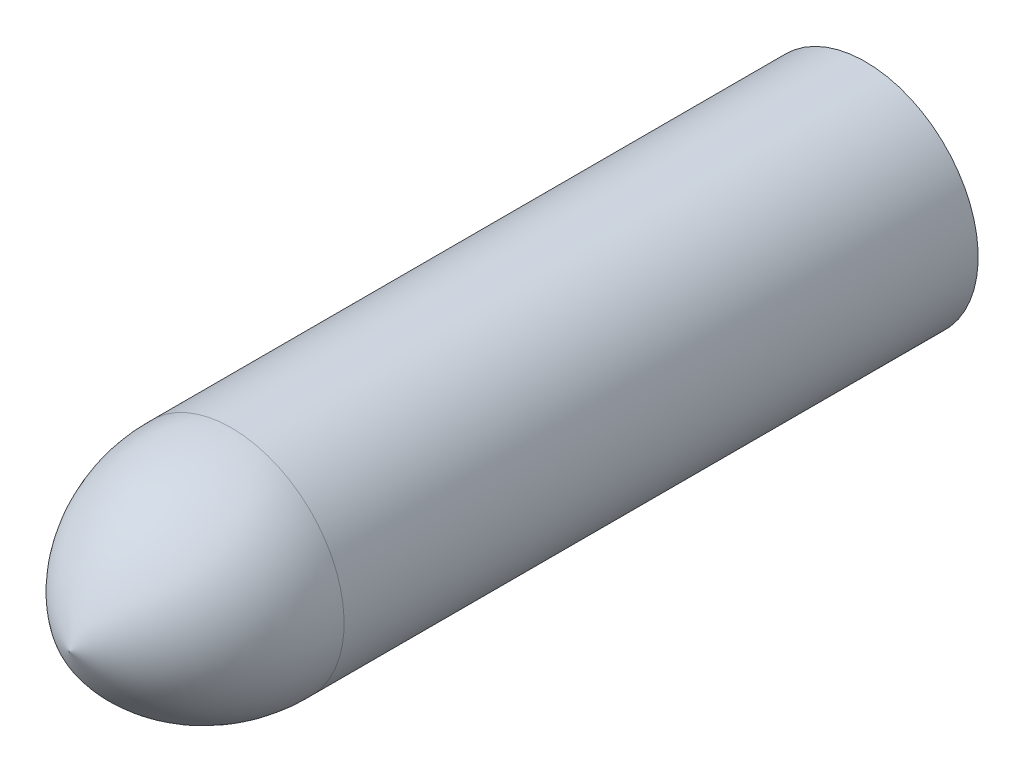
ISO-10303-21;
HEADER;
FILE_DESCRIPTION(('STEP AP214'),'2;1');
FILE_NAME('part.step','',(''),(''),'','','');
FILE_SCHEMA(('AUTOMOTIVE_DESIGN { 1 0 10303 214 1 1 1 1 }'));
ENDSEC;
DATA;
#1=APPLICATION_CONTEXT('core data for automotive mechanical design processes');
#2=APPLICATION_PROTOCOL_DEFINITION('international standard','automotive_design',2000,#1);
#3=PRODUCT_CONTEXT('',#1,'mechanical');
#4=PRODUCT('Part','Part','',(#3));
#5=PRODUCT_RELATED_PRODUCT_CATEGORY('part','',(#4));
#6=PRODUCT_DEFINITION_FORMATION('','',#4);
#7=PRODUCT_DEFINITION_CONTEXT('part definition',#1,'design');
#8=PRODUCT_DEFINITION('design','',#6,#7);
#9=PRODUCT_DEFINITION_SHAPE('','',#8);
#10=(LENGTH_UNIT() NAMED_UNIT(*) SI_UNIT(.MILLI.,.METRE.));
#11=(NAMED_UNIT(*) PLANE_ANGLE_UNIT() SI_UNIT($,.RADIAN.));
#12=(NAMED_UNIT(*) SI_UNIT($,.STERADIAN.) SOLID_ANGLE_UNIT());
#13=UNCERTAINTY_MEASURE_WITH_UNIT(LENGTH_MEASURE(1.E-05),#10,'distance_accuracy_value','');
#14=(GEOMETRIC_REPRESENTATION_CONTEXT(3) GLOBAL_UNCERTAINTY_ASSIGNED_CONTEXT((#13)) GLOBAL_UNIT_ASSIGNED_CONTEXT((#10,
#11,#12)) REPRESENTATION_CONTEXT('',''));
#15=CARTESIAN_POINT('',(0.,0.,0.));
#16=DIRECTION('',(0.,0.,1.));
#17=DIRECTION('',(1.,0.,0.));
#18=AXIS2_PLACEMENT_3D('',#15,#16,#17);
#19=CARTESIAN_POINT('',(0.,0.,180.));
#20=DIRECTION('',(0.,0.,-1.));
#21=DIRECTION('',(-1.,0.,0.));
#22=AXIS2_PLACEMENT_3D('',#19,#20,#21);
#23=CYLINDRICAL_SURFACE('',#22,32.);
#24=CARTESIAN_POINT('',(0.,0.,180.));
#25=DIRECTION('',(0.,0.,1.));
#26=DIRECTION('',(1.,0.,0.));
#27=AXIS2_PLACEMENT_3D('',#24,#25,#26);
#28=CIRCLE('',#27,32.);
#29=CARTESIAN_POINT('',(-32.,0.,180.));
#30=VERTEX_POINT('',#29);
#31=EDGE_CURVE('E11',#30,#30,#28,.T.);
#32=CARTESIAN_POINT('',(0.,0.,0.));
#33=DIRECTION('',(0.,0.,1.));
#34=DIRECTION('',(1.,0.,0.));
#35=AXIS2_PLACEMENT_3D('',#32,#33,#34);
#36=CIRCLE('',#35,32.);
#37=CARTESIAN_POINT('',(-32.,0.,0.));
#38=VERTEX_POINT('',#37);
#39=EDGE_CURVE('E35',#38,#38,#36,.T.);
#40=CARTESIAN_POINT('',(-32.,0.,180.));
#41=CARTESIAN_POINT('',(-32.,0.,178.125));
#42=CARTESIAN_POINT('',(-32.,0.,176.25));
#43=CARTESIAN_POINT('',(-32.,0.,172.5));
#44=CARTESIAN_POINT('',(-32.,0.,170.625));
#45=CARTESIAN_POINT('',(-32.,0.,166.875));
#46=CARTESIAN_POINT('',(-32.,0.,165.));
#47=CARTESIAN_POINT('',(-32.,0.,161.25));
#48=CARTESIAN_POINT('',(-32.,0.,159.375));
#49=CARTESIAN_POINT('',(-32.,0.,155.625));
#50=CARTESIAN_POINT('',(-32.,0.,153.75));
#51=CARTESIAN_POINT('',(-32.,0.,150.));
#52=CARTESIAN_POINT('',(-32.,0.,148.125));
#53=CARTESIAN_POINT('',(-32.,0.,144.375));
#54=CARTESIAN_POINT('',(-32.,0.,142.5));
#55=CARTESIAN_POINT('',(-32.,0.,138.75));
#56=CARTESIAN_POINT('',(-32.,0.,136.875));
#57=CARTESIAN_POINT('',(-32.,0.,133.125));
#58=CARTESIAN_POINT('',(-32.,0.,131.25));
#59=CARTESIAN_POINT('',(-32.,0.,127.5));
#60=CARTESIAN_POINT('',(-32.,0.,125.625));
#61=CARTESIAN_POINT('',(-32.,0.,121.875));
#62=CARTESIAN_POINT('',(-32.,0.,120.));
#63=CARTESIAN_POINT('',(-32.,0.,116.25));
#64=CARTESIAN_POINT('',(-32.,0.,114.375));
#65=CARTESIAN_POINT('',(-32.,0.,110.625));
#66=CARTESIAN_POINT('',(-32.,0.,108.75));
#67=CARTESIAN_POINT('',(-32.,0.,105.));
#68=CARTESIAN_POINT('',(-32.,0.,103.125));
#69=CARTESIAN_POINT('',(-32.,0.,99.375));
#70=CARTESIAN_POINT('',(-32.,0.,97.5));
#71=CARTESIAN_POINT('',(-32.,0.,93.75));
#72=CARTESIAN_POINT('',(-32.,0.,91.875));
#73=CARTESIAN_POINT('',(-32.,0.,88.125));
#74=CARTESIAN_POINT('',(-32.,0.,86.25));
#75=CARTESIAN_POINT('',(-32.,0.,82.5));
#76=CARTESIAN_POINT('',(-32.,0.,80.625));
#77=CARTESIAN_POINT('',(-32.,0.,76.875));
#78=CARTESIAN_POINT('',(-32.,0.,75.));
#79=CARTESIAN_POINT('',(-32.,0.,71.25));
#80=CARTESIAN_POINT('',(-32.,0.,69.375));
#81=CARTESIAN_POINT('',(-32.,0.,65.625));
#82=CARTESIAN_POINT('',(-32.,0.,63.75));
#83=CARTESIAN_POINT('',(-32.,0.,60.));
#84=CARTESIAN_POINT('',(-32.,0.,58.125));
#85=CARTESIAN_POINT('',(-32.,0.,54.375));
#86=CARTESIAN_POINT('',(-32.,0.,52.5));
#87=CARTESIAN_POINT('',(-32.,0.,48.75));
#88=CARTESIAN_POINT('',(-32.,0.,46.875));
#89=CARTESIAN_POINT('',(-32.,0.,43.125));
#90=CARTESIAN_POINT('',(-32.,0.,41.25));
#91=CARTESIAN_POINT('',(-32.,0.,37.5));
#92=CARTESIAN_POINT('',(-32.,0.,35.625));
#93=CARTESIAN_POINT('',(-32.,0.,31.875));
#94=CARTESIAN_POINT('',(-32.,0.,30.));
#95=CARTESIAN_POINT('',(-32.,0.,26.25));
#96=CARTESIAN_POINT('',(-32.,0.,24.375));
#97=CARTESIAN_POINT('',(-32.,0.,20.625));
#98=CARTESIAN_POINT('',(-32.,0.,18.75));
#99=CARTESIAN_POINT('',(-32.,0.,15.));
#100=CARTESIAN_POINT('',(-32.,0.,13.125));
#101=CARTESIAN_POINT('',(-32.,0.,9.37499999999998));
#102=CARTESIAN_POINT('',(-32.,0.,7.49999999999997));
#103=CARTESIAN_POINT('',(-32.,0.,3.74999999999997));
#104=CARTESIAN_POINT('',(-32.,0.,1.87499999999997));
#105=CARTESIAN_POINT('',(-32.,0.,0.));
#106=B_SPLINE_CURVE_WITH_KNOTS('',3,(#40,#41,#42,#43,#44,#45,#46,#47,#48,#49,#50,#51,#52,#53,
#54,#55,#56,#57,#58,#59,#60,#61,#62,#63,#64,#65,#66,#67,#68,#69,#70,#71,#72,#73,#74,#75,#76,#77,
#78,#79,#80,#81,#82,#83,#84,#85,#86,#87,#88,#89,#90,#91,#92,#93,#94,#95,#96,#97,#98,#99,#100,
#101,#102,#103,#104,#105),.UNSPECIFIED.,.F.,.F.,(4,2,2,2,2,2,2,2,2,2,2,2,2,2,2,2,2,2,2,2,2,2,2,
2,2,2,2,2,2,2,2,2,4),(0.,5.62500000000002,11.25,16.875,22.5,28.125,33.75,39.375,45.,50.625,
56.25,61.875,67.5,73.125,78.75,84.375,90.,95.625,101.25,106.875,112.5,118.125,123.75,129.375,
135.,140.625,146.25,151.875,157.5,163.125,168.75,174.375,180.),.UNSPECIFIED.);
#107=EDGE_CURVE('BSEAM32',#30,#38,#106,.T.);
#108=ORIENTED_EDGE('',*,*,#31,.F.);
#109=ORIENTED_EDGE('',*,*,#39,.T.);
#110=ORIENTED_EDGE('',*,*,#107,.T.);
#111=ORIENTED_EDGE('',*,*,#107,.F.);
#112=EDGE_LOOP('',(#108,#110,#109,#111));
#113=FACE_BOUND('',#112,.T.);
#114=ADVANCED_FACE('F32',(#113),#23,.T.);
#115=CARTESIAN_POINT('',(0.,0.,0.));
#116=DIRECTION('',(0.,0.,1.));
#117=DIRECTION('',(1.,0.,0.));
#118=AXIS2_PLACEMENT_3D('',#115,#116,#117);
#119=PLANE('',#118);
#120=ORIENTED_EDGE('',*,*,#39,.F.);
#121=EDGE_LOOP('',(#120));
#122=FACE_BOUND('',#121,.T.);
#123=ADVANCED_FACE('F43',(#122),#119,.F.);
#124=CARTESIAN_POINT('',(0.,-15.9942470943412,180.74313245611));
#125=DIRECTION('',(-1.,0.,0.));
#126=DIRECTION('',(0.,1.,0.));
#127=AXIS2_PLACEMENT_3D('',#124,#125,#126);
#128=CIRCLE('',#127,48.);
#129=TRIMMED_CURVE('',#128,(PARAMETER_VALUE(-1.23108653694085)),
(PARAMETER_VALUE(1.23108653694085)),.T.,.PARAMETER.);
#130=CARTESIAN_POINT('',(0.,0.,180.74313245611));
#131=DIRECTION('',(0.,0.,-1.));
#132=AXIS1_PLACEMENT('',#130,#131);
#133=SURFACE_OF_REVOLUTION('',#129,#132);
#134=ORIENTED_EDGE('',*,*,#31,.T.);
#135=EDGE_LOOP('',(#134));
#136=FACE_BOUND('',#135,.T.);
#137=CARTESIAN_POINT('',(0.,0.,226.));
#138=VERTEX_POINT('',#137);
#139=VERTEX_LOOP('',#138);
#140=FACE_BOUND('',#139,.T.);
#141=ADVANCED_FACE('F41',(#136,#140),#133,.T.);
#142=CLOSED_SHELL('',(#114,#123,#141));
#143=MANIFOLD_SOLID_BREP('B2',#142);
#144=ADVANCED_BREP_SHAPE_REPRESENTATION('',(#18,#143),#14);
#145=SHAPE_DEFINITION_REPRESENTATION(#9,#144);
ENDSEC;
END-ISO-10303-21;
